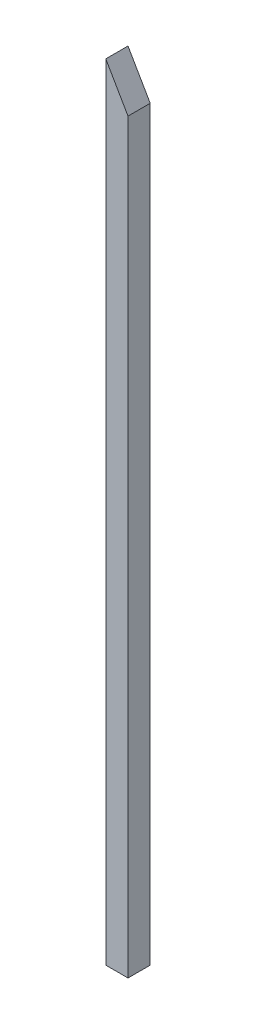
ISO-10303-21;
HEADER;
FILE_DESCRIPTION(('STEP AP214'),'2;1');
FILE_NAME('part.step','',(''),(''),'','','');
FILE_SCHEMA(('AUTOMOTIVE_DESIGN { 1 0 10303 214 1 1 1 1 }'));
ENDSEC;
DATA;
#1=APPLICATION_CONTEXT('core data for automotive mechanical design processes');
#2=APPLICATION_PROTOCOL_DEFINITION('international standard','automotive_design',2000,#1);
#3=PRODUCT_CONTEXT('',#1,'mechanical');
#4=PRODUCT('Part','Part','',(#3));
#5=PRODUCT_RELATED_PRODUCT_CATEGORY('part','',(#4));
#6=PRODUCT_DEFINITION_FORMATION('','',#4);
#7=PRODUCT_DEFINITION_CONTEXT('part definition',#1,'design');
#8=PRODUCT_DEFINITION('design','',#6,#7);
#9=PRODUCT_DEFINITION_SHAPE('','',#8);
#10=(LENGTH_UNIT() NAMED_UNIT(*) SI_UNIT(.MILLI.,.METRE.));
#11=(NAMED_UNIT(*) PLANE_ANGLE_UNIT() SI_UNIT($,.RADIAN.));
#12=(NAMED_UNIT(*) SI_UNIT($,.STERADIAN.) SOLID_ANGLE_UNIT());
#13=UNCERTAINTY_MEASURE_WITH_UNIT(LENGTH_MEASURE(1.E-05),#10,'distance_accuracy_value','');
#14=(GEOMETRIC_REPRESENTATION_CONTEXT(3) GLOBAL_UNCERTAINTY_ASSIGNED_CONTEXT((#13)) GLOBAL_UNIT_ASSIGNED_CONTEXT((#10,
#11,#12)) REPRESENTATION_CONTEXT('',''));
#15=CARTESIAN_POINT('',(0.,0.,0.));
#16=DIRECTION('',(0.,0.,1.));
#17=DIRECTION('',(1.,0.,0.));
#18=AXIS2_PLACEMENT_3D('',#15,#16,#17);
#19=CARTESIAN_POINT('',(0.,600.,0.));
#20=DIRECTION('',(1.,0.,0.));
#21=DIRECTION('',(0.,0.,-1.));
#22=AXIS2_PLACEMENT_3D('',#19,#20,#21);
#23=PLANE('',#22);
#24=DIRECTION('',(0.,-1.,0.));
#25=VECTOR('',#24,1.);
#26=CARTESIAN_POINT('',(0.,600.,30.));
#27=LINE('',#26,#25);
#28=CARTESIAN_POINT('',(0.,540.,30.));
#29=VERTEX_POINT('',#28);
#30=CARTESIAN_POINT('',(0.,-519.62,30.));
#31=VERTEX_POINT('',#30);
#32=EDGE_CURVE('E11',#29,#31,#27,.T.);
#33=ORIENTED_EDGE('',*,*,#32,.F.);
#34=DIRECTION('',(0.,0.,1.));
#35=VECTOR('',#34,1.);
#36=CARTESIAN_POINT('',(0.,540.,-115.911099154688));
#37=LINE('',#36,#35);
#38=CARTESIAN_POINT('',(0.,540.,0.));
#39=VERTEX_POINT('',#38);
#40=EDGE_CURVE('E93',#39,#29,#37,.T.);
#41=ORIENTED_EDGE('',*,*,#40,.F.);
#42=DIRECTION('',(0.,-1.,0.));
#43=VECTOR('',#42,1.);
#44=CARTESIAN_POINT('',(0.,600.,0.));
#45=LINE('',#44,#43);
#46=CARTESIAN_POINT('',(0.,-519.62,0.));
#47=VERTEX_POINT('',#46);
#48=EDGE_CURVE('E99',#39,#47,#45,.T.);
#49=ORIENTED_EDGE('',*,*,#48,.T.);
#50=DIRECTION('',(0.,0.,1.));
#51=VECTOR('',#50,1.);
#52=CARTESIAN_POINT('',(0.,-519.62,0.));
#53=LINE('',#52,#51);
#54=EDGE_CURVE('E84',#47,#31,#53,.T.);
#55=ORIENTED_EDGE('',*,*,#54,.T.);
#56=EDGE_LOOP('',(#33,#41,#49,#55));
#57=FACE_BOUND('',#56,.T.);
#58=ADVANCED_FACE('F36',(#57),#23,.F.);
#59=CARTESIAN_POINT('',(0.,600.,30.));
#60=DIRECTION('',(0.,0.,-1.));
#61=DIRECTION('',(-1.,0.,0.));
#62=AXIS2_PLACEMENT_3D('',#59,#60,#61);
#63=PLANE('',#62);
#64=DIRECTION('',(0.,-1.,0.));
#65=VECTOR('',#64,1.);
#66=CARTESIAN_POINT('',(30.,600.,30.));
#67=LINE('',#66,#65);
#68=CARTESIAN_POINT('',(30.,488.038475772934,30.));
#69=VERTEX_POINT('',#68);
#70=CARTESIAN_POINT('',(30.,-519.62,30.));
#71=VERTEX_POINT('',#70);
#72=EDGE_CURVE('E43',#69,#71,#67,.T.);
#73=ORIENTED_EDGE('',*,*,#72,.F.);
#74=DIRECTION('',(0.499999999999999,-0.86602540378444,0.));
#75=VECTOR('',#74,1.);
#76=CARTESIAN_POINT('',(30.,488.038475772934,30.));
#77=LINE('',#76,#75);
#78=EDGE_CURVE('E50',#29,#69,#77,.T.);
#79=ORIENTED_EDGE('',*,*,#78,.F.);
#80=ORIENTED_EDGE('',*,*,#32,.T.);
#81=DIRECTION('',(1.,0.,0.));
#82=VECTOR('',#81,1.);
#83=CARTESIAN_POINT('',(0.,-519.62,30.));
#84=LINE('',#83,#82);
#85=EDGE_CURVE('E82',#31,#71,#84,.T.);
#86=ORIENTED_EDGE('',*,*,#85,.T.);
#87=EDGE_LOOP('',(#73,#79,#80,#86));
#88=FACE_BOUND('',#87,.T.);
#89=ADVANCED_FACE('F86',(#88),#63,.F.);
#90=CARTESIAN_POINT('',(30.,600.,0.));
#91=DIRECTION('',(-1.,0.,0.));
#92=DIRECTION('',(0.,0.,1.));
#93=AXIS2_PLACEMENT_3D('',#90,#91,#92);
#94=PLANE('',#93);
#95=DIRECTION('',(0.,-1.,0.));
#96=VECTOR('',#95,1.);
#97=CARTESIAN_POINT('',(30.,600.,0.));
#98=LINE('',#97,#96);
#99=CARTESIAN_POINT('',(30.,488.038475772934,0.));
#100=VERTEX_POINT('',#99);
#101=CARTESIAN_POINT('',(30.,-519.62,0.));
#102=VERTEX_POINT('',#101);
#103=EDGE_CURVE('E59',#100,#102,#98,.T.);
#104=ORIENTED_EDGE('',*,*,#103,.F.);
#105=DIRECTION('',(0.,0.,-1.));
#106=VECTOR('',#105,1.);
#107=CARTESIAN_POINT('',(30.,488.038475772934,30.001));
#108=LINE('',#107,#106);
#109=EDGE_CURVE('E75',#69,#100,#108,.T.);
#110=ORIENTED_EDGE('',*,*,#109,.F.);
#111=ORIENTED_EDGE('',*,*,#72,.T.);
#112=DIRECTION('',(0.,0.,1.));
#113=VECTOR('',#112,1.);
#114=CARTESIAN_POINT('',(30.,-519.62,0.));
#115=LINE('',#114,#113);
#116=EDGE_CURVE('E73',#102,#71,#115,.T.);
#117=ORIENTED_EDGE('',*,*,#116,.F.);
#118=EDGE_LOOP('',(#104,#110,#111,#117));
#119=FACE_BOUND('',#118,.T.);
#120=ADVANCED_FACE('F72',(#119),#94,.F.);
#121=CARTESIAN_POINT('',(0.,600.,0.));
#122=DIRECTION('',(0.,0.,1.));
#123=DIRECTION('',(1.,0.,0.));
#124=AXIS2_PLACEMENT_3D('',#121,#122,#123);
#125=PLANE('',#124);
#126=ORIENTED_EDGE('',*,*,#48,.F.);
#127=DIRECTION('',(-0.499999999999999,0.866025403784439,0.));
#128=VECTOR('',#127,1.);
#129=CARTESIAN_POINT('',(30.,488.038475772934,0.));
#130=LINE('',#129,#128);
#131=EDGE_CURVE('E89',#100,#39,#130,.T.);
#132=ORIENTED_EDGE('',*,*,#131,.F.);
#133=ORIENTED_EDGE('',*,*,#103,.T.);
#134=DIRECTION('',(1.,0.,0.));
#135=VECTOR('',#134,1.);
#136=CARTESIAN_POINT('',(0.,-519.62,0.));
#137=LINE('',#136,#135);
#138=EDGE_CURVE('E83',#47,#102,#137,.T.);
#139=ORIENTED_EDGE('',*,*,#138,.F.);
#140=EDGE_LOOP('',(#126,#132,#133,#139));
#141=FACE_BOUND('',#140,.T.);
#142=ADVANCED_FACE('F104',(#141),#125,.F.);
#143=CARTESIAN_POINT('',(0.,-519.62,0.));
#144=DIRECTION('',(0.,-1.,0.));
#145=DIRECTION('',(1.,0.,0.));
#146=AXIS2_PLACEMENT_3D('',#143,#144,#145);
#147=PLANE('',#146);
#148=ORIENTED_EDGE('',*,*,#85,.F.);
#149=ORIENTED_EDGE('',*,*,#54,.F.);
#150=ORIENTED_EDGE('',*,*,#138,.T.);
#151=ORIENTED_EDGE('',*,*,#116,.T.);
#152=EDGE_LOOP('',(#148,#149,#150,#151));
#153=FACE_BOUND('',#152,.T.);
#154=ADVANCED_FACE('F80',(#153),#147,.T.);
#155=CARTESIAN_POINT('',(30.,488.038475772934,-115.911099154688));
#156=DIRECTION('',(-0.866025403784439,-0.499999999999999,0.));
#157=DIRECTION('',(0.499999999999999,-0.866025403784439,0.));
#158=AXIS2_PLACEMENT_3D('',#155,#156,#157);
#159=PLANE('',#158);
#160=ORIENTED_EDGE('',*,*,#131,.T.);
#161=ORIENTED_EDGE('',*,*,#40,.T.);
#162=ORIENTED_EDGE('',*,*,#78,.T.);
#163=ORIENTED_EDGE('',*,*,#109,.T.);
#164=EDGE_LOOP('',(#160,#161,#162,#163));
#165=FACE_BOUND('',#164,.T.);
#166=ADVANCED_FACE('F112',(#165),#159,.F.);
#167=CLOSED_SHELL('',(#58,#89,#120,#142,#154,#166));
#168=MANIFOLD_SOLID_BREP('B2',#167);
#169=ADVANCED_BREP_SHAPE_REPRESENTATION('',(#18,#168),#14);
#170=SHAPE_DEFINITION_REPRESENTATION(#9,#169);
ENDSEC;
END-ISO-10303-21;
